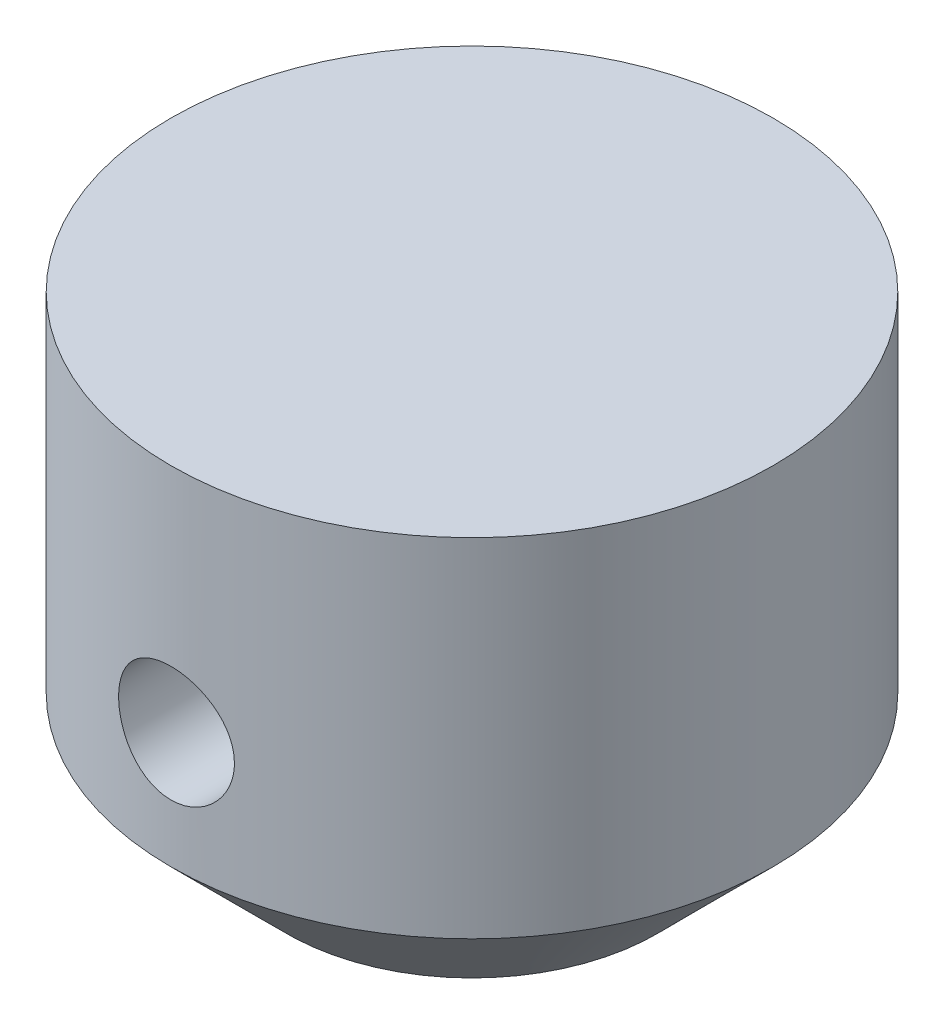
ISO-10303-21;
HEADER;
FILE_DESCRIPTION(('STEP AP214'),'2;1');
FILE_NAME('part.step','',(''),(''),'','','');
FILE_SCHEMA(('AUTOMOTIVE_DESIGN { 1 0 10303 214 1 1 1 1 }'));
ENDSEC;
DATA;
#1=APPLICATION_CONTEXT('core data for automotive mechanical design processes');
#2=APPLICATION_PROTOCOL_DEFINITION('international standard','automotive_design',2000,#1);
#3=PRODUCT_CONTEXT('',#1,'mechanical');
#4=PRODUCT('Part','Part','',(#3));
#5=PRODUCT_RELATED_PRODUCT_CATEGORY('part','',(#4));
#6=PRODUCT_DEFINITION_FORMATION('','',#4);
#7=PRODUCT_DEFINITION_CONTEXT('part definition',#1,'design');
#8=PRODUCT_DEFINITION('design','',#6,#7);
#9=PRODUCT_DEFINITION_SHAPE('','',#8);
#10=(LENGTH_UNIT() NAMED_UNIT(*) SI_UNIT(.MILLI.,.METRE.));
#11=(NAMED_UNIT(*) PLANE_ANGLE_UNIT() SI_UNIT($,.RADIAN.));
#12=(NAMED_UNIT(*) SI_UNIT($,.STERADIAN.) SOLID_ANGLE_UNIT());
#13=UNCERTAINTY_MEASURE_WITH_UNIT(LENGTH_MEASURE(1.E-05),#10,'distance_accuracy_value','');
#14=(GEOMETRIC_REPRESENTATION_CONTEXT(3) GLOBAL_UNCERTAINTY_ASSIGNED_CONTEXT((#13)) GLOBAL_UNIT_ASSIGNED_CONTEXT((#10,
#11,#12)) REPRESENTATION_CONTEXT('',''));
#15=CARTESIAN_POINT('',(0.,0.,0.));
#16=DIRECTION('',(0.,0.,1.));
#17=DIRECTION('',(1.,0.,0.));
#18=AXIS2_PLACEMENT_3D('',#15,#16,#17);
#19=CARTESIAN_POINT('',(0.,-32.,0.));
#20=DIRECTION('',(0.,1.,0.));
#21=DIRECTION('',(0.,0.,1.));
#22=AXIS2_PLACEMENT_3D('',#19,#20,#21);
#23=PLANE('',#22);
#24=CARTESIAN_POINT('',(0.,-32.,0.));
#25=DIRECTION('',(0.,-1.,0.));
#26=DIRECTION('',(0.,0.,-1.));
#27=AXIS2_PLACEMENT_3D('',#24,#25,#26);
#28=CIRCLE('',#27,2.6);
#29=CARTESIAN_POINT('',(0.,-32.,-2.6));
#30=VERTEX_POINT('',#29);
#31=EDGE_CURVE('E10',#30,#30,#28,.T.);
#32=ORIENTED_EDGE('',*,*,#31,.F.);
#33=EDGE_LOOP('',(#32));
#34=FACE_BOUND('',#33,.T.);
#35=ADVANCED_FACE('F31',(#34),#23,.T.);
#36=CARTESIAN_POINT('',(0.,-40.,0.));
#37=DIRECTION('',(0.,-1.,0.));
#38=DIRECTION('',(0.,0.,-1.));
#39=AXIS2_PLACEMENT_3D('',#36,#37,#38);
#40=CYLINDRICAL_SURFACE('',#39,2.6);
#41=CARTESIAN_POINT('',(0.,-33.5,-2.6));
#42=CARTESIAN_POINT('',(0.0278105320361505,-33.5000010482439,-2.59999949221967));
#43=CARTESIAN_POINT('',(0.0556345546144306,-33.5023281174596,-2.59954919613991));
#44=CARTESIAN_POINT('',(0.110497626618271,-33.5115683889724,-2.59779628991213));
#45=CARTESIAN_POINT('',(0.137536008978919,-33.5184853761372,-2.5964929763741));
#46=CARTESIAN_POINT('',(0.190026507492474,-33.5366851160976,-2.59317972986679));
#47=CARTESIAN_POINT('',(0.215480063942747,-33.5479638356547,-2.59117044985226));
#48=CARTESIAN_POINT('',(0.264131447684717,-33.5745552255853,-2.58666430975677));
#49=CARTESIAN_POINT('',(0.287329439097689,-33.5898676021572,-2.58416748519075));
#50=CARTESIAN_POINT('',(0.331104865948445,-33.6242958331416,-2.57892646004871));
#51=CARTESIAN_POINT('',(0.35164985907351,-33.6434525662902,-2.57617979097233));
#52=CARTESIAN_POINT('',(0.389255337231235,-33.6849378074389,-2.57076682723467));
#53=CARTESIAN_POINT('',(0.406315563890704,-33.7072665504153,-2.56810053854555));
#54=CARTESIAN_POINT('',(0.436603359241242,-33.7546927990716,-2.56312618803904));
#55=CARTESIAN_POINT('',(0.449797702900451,-33.7798118862201,-2.56082130653019));
#56=CARTESIAN_POINT('',(0.471766440630374,-33.8319619820053,-2.55686562512146));
#57=CARTESIAN_POINT('',(0.480541236670556,-33.8589928165085,-2.55521476573947));
#58=CARTESIAN_POINT('',(0.493317220914277,-33.9138512383438,-2.55277894025527));
#59=CARTESIAN_POINT('',(0.497375117583084,-33.9416651533394,-2.55198369644114));
#60=CARTESIAN_POINT('',(0.500778180369521,-33.997589527384,-2.5513181755189));
#61=CARTESIAN_POINT('',(0.500123791374384,-34.0256999581887,-2.55144781109284));
#62=CARTESIAN_POINT('',(0.494166791217106,-34.0810070446324,-2.55260805168359));
#63=CARTESIAN_POINT('',(0.488928861300105,-34.108210968953,-2.55362611893243));
#64=CARTESIAN_POINT('',(0.474055416271553,-34.1613465966231,-2.55642880078043));
#65=CARTESIAN_POINT('',(0.464419705520661,-34.1872782433175,-2.55821344948145));
#66=CARTESIAN_POINT('',(0.440961530918623,-34.2373213887639,-2.56236120704715));
#67=CARTESIAN_POINT('',(0.427113131194455,-34.2614204221016,-2.56472788141454));
#68=CARTESIAN_POINT('',(0.395641010178694,-34.3069769942277,-2.56977069421259));
#69=CARTESIAN_POINT('',(0.378016886537293,-34.3284342511183,-2.57244686560998));
#70=CARTESIAN_POINT('',(0.339145782265337,-34.3684717068442,-2.57786164761939));
#71=CARTESIAN_POINT('',(0.317843522311988,-34.3869982380074,-2.58060055730789));
#72=CARTESIAN_POINT('',(0.272405331230797,-34.4202231014601,-2.58579144205795));
#73=CARTESIAN_POINT('',(0.248269368824891,-34.4349213914882,-2.58824341395175));
#74=CARTESIAN_POINT('',(0.197791552497752,-34.4600812094079,-2.59258949722063));
#75=CARTESIAN_POINT('',(0.171446742608608,-34.4705369469234,-2.5944828452127));
#76=CARTESIAN_POINT('',(0.117330113839421,-34.4868594846694,-2.59749249443284));
#77=CARTESIAN_POINT('',(0.0895584549284664,-34.492726798133,-2.5986088825654));
#78=CARTESIAN_POINT('',(0.0338379830289236,-34.4996307532307,-2.59992682566096));
#79=CARTESIAN_POINT('',(0.00589859559906434,-34.5007408943682,-2.60014229870909));
#80=CARTESIAN_POINT('',(-0.0497665273185639,-34.4982964445607,-2.59967265997688));
#81=CARTESIAN_POINT('',(-0.0774922737973493,-34.4947420952195,-2.5989875948412));
#82=CARTESIAN_POINT('',(-0.131708448516044,-34.483130651201,-2.59680253743915));
#83=CARTESIAN_POINT('',(-0.158207180744999,-34.4751109443148,-2.59530931462721));
#84=CARTESIAN_POINT('',(-0.20948391120038,-34.4548370439751,-2.59167470897715));
#85=CARTESIAN_POINT('',(-0.234261787783941,-34.4425825515405,-2.58953328037625));
#86=CARTESIAN_POINT('',(-0.281705736534493,-34.4140256513651,-2.5848050930694));
#87=CARTESIAN_POINT('',(-0.304344437052664,-34.3976785816926,-2.58221352450716));
#88=CARTESIAN_POINT('',(-0.346583721086208,-34.3614607553005,-2.57688451035751));
#89=CARTESIAN_POINT('',(-0.366184004761787,-34.3415896512332,-2.5741470504089));
#90=CARTESIAN_POINT('',(-0.402071020329724,-34.2985543677208,-2.56878832767845));
#91=CARTESIAN_POINT('',(-0.418307478477022,-34.2753479499434,-2.56616923031455));
#92=CARTESIAN_POINT('',(-0.446651897666632,-34.2264939351453,-2.56138820751886));
#93=CARTESIAN_POINT('',(-0.458760016864744,-34.2008464316903,-2.55922626457479));
#94=CARTESIAN_POINT('',(-0.478433768375435,-34.1479627282108,-2.55562151463548));
#95=CARTESIAN_POINT('',(-0.486021955190554,-34.1207351733065,-2.5541751431704));
#96=CARTESIAN_POINT('',(-0.496509581086891,-34.0653609853587,-2.55215737464282));
#97=CARTESIAN_POINT('',(-0.499409579983776,-34.0372144624585,-2.55158587311269));
#98=CARTESIAN_POINT('',(-0.500419023374696,-33.9813053288157,-2.55138804101293));
#99=CARTESIAN_POINT('',(-0.498607820424415,-33.9535441754065,-2.5517460540877));
#100=CARTESIAN_POINT('',(-0.490420533076082,-33.8987300110987,-2.55333209593232));
#101=CARTESIAN_POINT('',(-0.484044479382371,-33.8716769954382,-2.55456011885027));
#102=CARTESIAN_POINT('',(-0.466942695434997,-33.8190926760316,-2.55774106519254));
#103=CARTESIAN_POINT('',(-0.456225988400775,-33.7935583408165,-2.55969248413398));
#104=CARTESIAN_POINT('',(-0.430755941571054,-33.7446375276218,-2.56410133067948));
#105=CARTESIAN_POINT('',(-0.416002296269836,-33.7212512123782,-2.56655879657648));
#106=CARTESIAN_POINT('',(-0.382603127628857,-33.6768936850631,-2.57175118060547));
#107=CARTESIAN_POINT('',(-0.363900019707691,-33.6559662637036,-2.57448985593022));
#108=CARTESIAN_POINT('',(-0.323252476970016,-33.6175205249011,-2.57990840632291));
#109=CARTESIAN_POINT('',(-0.301307298652148,-33.6000029915864,-2.58258826774076));
#110=CARTESIAN_POINT('',(-0.254547251469325,-33.5687173966289,-2.58761731411782));
#111=CARTESIAN_POINT('',(-0.229706986973882,-33.5549867259862,-2.58996309802487));
#112=CARTESIAN_POINT('',(-0.178034451870081,-33.5319158415272,-2.59402638153398));
#113=CARTESIAN_POINT('',(-0.151204050658971,-33.5225715664262,-2.59574446198726));
#114=CARTESIAN_POINT('',(-0.103584713141109,-33.5104030831571,-2.59801468750044));
#115=CARTESIAN_POINT('',(-0.0830714879403355,-33.5065087020495,-2.59875491800667));
#116=CARTESIAN_POINT('',(-0.0417080317029372,-33.5013068032726,-2.59974775790777));
#117=CARTESIAN_POINT('',(-0.0208578100340655,-33.4999992138204,-2.60000038083362));
#118=CARTESIAN_POINT('',(0.,-33.5,-2.6));
#119=B_SPLINE_CURVE_WITH_KNOTS('',3,(#41,#42,#43,#44,#45,#46,#47,#48,#49,#50,#51,#52,#53,#54,
#55,#56,#57,#58,#59,#60,#61,#62,#63,#64,#65,#66,#67,#68,#69,#70,#71,#72,#73,#74,#75,#76,#77,#78,
#79,#80,#81,#82,#83,#84,#85,#86,#87,#88,#89,#90,#91,#92,#93,#94,#95,#96,#97,#98,#99,#100,#101,
#102,#103,#104,#105,#106,#107,#108,#109,#110,#111,#112,#113,#114,#115,#116,#117,#118),
.UNSPECIFIED.,.T.,.F.,(4,2,2,2,2,2,2,2,2,2,2,2,2,2,2,2,2,2,2,2,2,2,2,2,2,2,2,2,2,2,2,2,2,2,2,2,
2,2,4),(0.,0.0833553081145132,0.166779436959304,0.250126608314659,0.333467710549167,
0.417747064808198,0.502032665577042,0.587022723648483,0.672005050254293,0.75595475796966,
0.839896540090919,0.922672529398886,1.00545220143214,1.08875219974061,1.17206107910736,
1.25675278715131,1.34144543009992,1.42625327868009,1.51105163981266,1.59453501139906,
1.67801405901662,1.76080443698833,1.84360066125531,1.92734314190811,2.01109388125848,
2.096018049533,2.18093896401477,2.26543249308995,2.34991593206271,2.43298563424709,
2.51605477768889,2.59895211856998,2.68185573465715,2.7660638086393,2.85029122405397,
2.93532272054677,3.02027533186145,3.08279328109365,3.14530949544452),.UNSPECIFIED.);
#120=CARTESIAN_POINT('',(0.,-33.5,-2.6));
#121=VERTEX_POINT('',#120);
#122=EDGE_CURVE('E34',#121,#121,#119,.T.);
#123=ORIENTED_EDGE('',*,*,#122,.F.);
#124=EDGE_LOOP('',(#123));
#125=FACE_BOUND('',#124,.T.);
#126=CARTESIAN_POINT('',(0.5,-34.,2.55147016443461));
#127=CARTESIAN_POINT('',(0.499998947542569,-33.972194828052,2.5514707090019));
#128=CARTESIAN_POINT('',(0.497672744922004,-33.9443761539758,2.55192962171195));
#129=CARTESIAN_POINT('',(0.488436227441484,-33.8895241882344,2.55371324682503));
#130=CARTESIAN_POINT('',(0.481522107224091,-33.8624915679906,2.55503867793111));
#131=CARTESIAN_POINT('',(0.463330749326355,-33.8100132710475,2.55839980127171));
#132=CARTESIAN_POINT('',(0.452057679705415,-33.784566105234,2.56043481481625));
#133=CARTESIAN_POINT('',(0.425479607106329,-33.7359254900133,2.56498500315722));
#134=CARTESIAN_POINT('',(0.410174884812432,-33.7127318838667,2.56750014452372));
#135=CARTESIAN_POINT('',(0.375754491644792,-33.6689517575125,2.57276395733468));
#136=CARTESIAN_POINT('',(0.356596223727371,-33.6483990100983,2.5755150220435));
#137=CARTESIAN_POINT('',(0.315104624516136,-33.6107784939706,2.58091959605602));
#138=CARTESIAN_POINT('',(0.292771079698348,-33.5937109598111,2.58357309878398));
#139=CARTESIAN_POINT('',(0.245340374215246,-33.5634153179484,2.58850927538913));
#140=CARTESIAN_POINT('',(0.220222457774032,-33.550219148259,2.59078879971796));
#141=CARTESIAN_POINT('',(0.168074895722151,-33.5282467149346,2.59469335391021));
#142=CARTESIAN_POINT('',(0.141045415707559,-33.519470068976,2.59631844038522));
#143=CARTESIAN_POINT('',(0.0861921690346895,-33.5066905192989,2.59871411017994));
#144=CARTESIAN_POINT('',(0.0583821276250202,-33.502630644976,2.59949488321994));
#145=CARTESIAN_POINT('',(0.0024654141881919,-33.4992222833556,2.60014910235426));
#146=CARTESIAN_POINT('',(-0.0256412311005026,-33.4998733749328,2.6000226295496));
#147=CARTESIAN_POINT('',(-0.0809623160579727,-33.5058249525212,2.59888454465995));
#148=CARTESIAN_POINT('',(-0.108183631217933,-33.5110640866262,2.59788461302393));
#149=CARTESIAN_POINT('',(-0.16135340993074,-33.5259458908625,2.59512509075811));
#150=CARTESIAN_POINT('',(-0.187301825301269,-33.5355887275423,2.59336547139697));
#151=CARTESIAN_POINT('',(-0.237366073448772,-33.5590620564288,2.58926486516198));
#152=CARTESIAN_POINT('',(-0.261470207038683,-33.572916889057,2.58692051374894));
#153=CARTESIAN_POINT('',(-0.307034293635919,-33.6044029587879,2.58190939572657));
#154=CARTESIAN_POINT('',(-0.328493963961025,-33.6220345990651,2.57924259470896));
#155=CARTESIAN_POINT('',(-0.36852369388809,-33.6609113018337,2.5738309069867));
#156=CARTESIAN_POINT('',(-0.387041577972691,-33.682210046847,2.57108545456181));
#157=CARTESIAN_POINT('',(-0.420250632706316,-33.7276380349345,2.56586687995174));
#158=CARTESIAN_POINT('',(-0.434941741447775,-33.7517673237906,2.56339376217262));
#159=CARTESIAN_POINT('',(-0.460096266503748,-33.8022428034542,2.55899893732967));
#160=CARTESIAN_POINT('',(-0.470551774921117,-33.8285930310247,2.55707826360321));
#161=CARTESIAN_POINT('',(-0.486872220148259,-33.8827215108758,2.55402135344012));
#162=CARTESIAN_POINT('',(-0.49273770637958,-33.9104995918193,2.55288502312021));
#163=CARTESIAN_POINT('',(-0.499634750441872,-33.9662238649257,2.55154412275902));
#164=CARTESIAN_POINT('',(-0.500741413971326,-33.9941604227368,2.55132507721333));
#165=CARTESIAN_POINT('',(-0.498291019927682,-34.0498190727739,2.55180476616839));
#166=CARTESIAN_POINT('',(-0.4947342056805,-34.0775411761137,2.55250345278471));
#167=CARTESIAN_POINT('',(-0.483122401197692,-34.1317349886385,2.55472637060047));
#168=CARTESIAN_POINT('',(-0.475107069349229,-34.1582155208333,2.5562433198263));
#169=CARTESIAN_POINT('',(-0.454847957308261,-34.2094577694909,2.55992552504786));
#170=CARTESIAN_POINT('',(-0.442603851473006,-34.2342193534072,2.56209083096951));
#171=CARTESIAN_POINT('',(-0.414062971823536,-34.281650848477,2.56685857074238));
#172=CARTESIAN_POINT('',(-0.397718922456543,-34.3042918028875,2.56946597998689));
#173=CARTESIAN_POINT('',(-0.361505575576465,-34.3465370237732,2.5748102724859));
#174=CARTESIAN_POINT('',(-0.341635943857633,-34.3661410020294,2.57754716799694));
#175=CARTESIAN_POINT('',(-0.298599362506024,-34.4020379504067,2.58288874565802));
#176=CARTESIAN_POINT('',(-0.275389848707324,-34.4182803064115,2.58549101777384));
#177=CARTESIAN_POINT('',(-0.226527880453212,-34.446635061219,2.59022908608141));
#178=CARTESIAN_POINT('',(-0.200875523447793,-34.4587476246793,2.59236490086991));
#179=CARTESIAN_POINT('',(-0.147993322740102,-34.4784239459671,2.59591906937718));
#180=CARTESIAN_POINT('',(-0.120772849682519,-34.4860121621292,2.59734127408174));
#181=CARTESIAN_POINT('',(-0.0654137550084261,-34.496502238924,2.59932444043486));
#182=CARTESIAN_POINT('',(-0.0372752356083847,-34.4994046194794,2.59988549763276));
#183=CARTESIAN_POINT('',(0.0186365504236367,-34.5004217662985,2.6000811174301));
#184=CARTESIAN_POINT('',(0.0464084057240731,-34.498612844466,2.59973044799484));
#185=CARTESIAN_POINT('',(0.101244581449823,-34.4904263839669,2.59817284039036));
#186=CARTESIAN_POINT('',(0.12830890942843,-34.4840488940931,2.5969659113661));
#187=CARTESIAN_POINT('',(0.180918709850875,-34.4669391615224,2.59383154948978));
#188=CARTESIAN_POINT('',(0.206467042275782,-34.4562154383296,2.59190552678676));
#189=CARTESIAN_POINT('',(0.255412976491685,-34.4307269770987,2.5875410506584));
#190=CARTESIAN_POINT('',(0.27881042410968,-34.4159619496856,2.58510256054109));
#191=CARTESIAN_POINT('',(0.323169591535494,-34.3825493099337,2.5799356961059));
#192=CARTESIAN_POINT('',(0.344089496980017,-34.3638467655831,2.57720352121692));
#193=CARTESIAN_POINT('',(0.382520333223743,-34.3232035634892,2.57178066550606));
#194=CARTESIAN_POINT('',(0.400030459267711,-34.3012621434693,2.56908999461735));
#195=CARTESIAN_POINT('',(0.431306904846719,-34.2545060322045,2.5640258452719));
#196=CARTESIAN_POINT('',(0.445034783203871,-34.2296652481983,2.56165574006755));
#197=CARTESIAN_POINT('',(0.46810030886517,-34.1779918452311,2.55754188332592));
#198=CARTESIAN_POINT('',(0.477442039558376,-34.1511611059269,2.5557975495702));
#199=CARTESIAN_POINT('',(0.489604272441328,-34.1035483250539,2.55349061919027));
#200=CARTESIAN_POINT('',(0.493495878958447,-34.0830424024803,2.5527375216888));
#201=CARTESIAN_POINT('',(0.498694098796309,-34.0416935107314,2.55172709752426));
#202=CARTESIAN_POINT('',(0.50000078921713,-34.0208505516275,2.55146975607431));
#203=CARTESIAN_POINT('',(0.5,-34.,2.55147016443461));
#204=B_SPLINE_CURVE_WITH_KNOTS('',3,(#126,#127,#128,#129,#130,#131,#132,#133,#134,#135,#136,
#137,#138,#139,#140,#141,#142,#143,#144,#145,#146,#147,#148,#149,#150,#151,#152,#153,#154,#155,
#156,#157,#158,#159,#160,#161,#162,#163,#164,#165,#166,#167,#168,#169,#170,#171,#172,#173,#174,
#175,#176,#177,#178,#179,#180,#181,#182,#183,#184,#185,#186,#187,#188,#189,#190,#191,#192,#193,
#194,#195,#196,#197,#198,#199,#200,#201,#202,#203),.UNSPECIFIED.,.T.,.F.,(4,2,2,2,2,2,2,2,2,2,2,
2,2,2,2,2,2,2,2,2,2,2,2,2,2,2,2,2,2,2,2,2,2,2,2,2,2,2,4),(0.,0.0833391977700211,
0.166747606135934,0.250076455217348,0.333399504464598,0.417699943651171,0.502006054370184,
0.58698928435361,0.671965161355514,0.755903638150818,0.839834611564477,0.922660098044567,
1.0054887172532,1.08880539343955,1.17213096812357,1.2568001838647,1.34147076925495,
1.42629871467811,1.51111650471832,1.59459063578512,1.67806041160203,1.76079933217464,
1.84354462559654,1.92729181840957,2.01104695423965,2.0959837188539,2.18091709658579,
2.26538706594041,2.34984766218162,2.43294873718912,2.51604892467846,2.5989870006597,
2.68193101692095,2.76611956404469,2.85032795681521,2.93536303815768,3.02031879631406,
3.08281508587339,3.14530951133299),.UNSPECIFIED.);
#205=CARTESIAN_POINT('',(0.5,-34.,2.55147016443461));
#206=VERTEX_POINT('',#205);
#207=EDGE_CURVE('E50',#206,#206,#204,.T.);
#208=ORIENTED_EDGE('',*,*,#207,.F.);
#209=EDGE_LOOP('',(#208));
#210=FACE_BOUND('',#209,.T.);
#211=ORIENTED_EDGE('',*,*,#31,.T.);
#212=EDGE_LOOP('',(#211));
#213=FACE_BOUND('',#212,.T.);
#214=CARTESIAN_POINT('',(0.,-35.,0.));
#215=DIRECTION('',(0.,-1.,0.));
#216=DIRECTION('',(0.,0.,-1.));
#217=AXIS2_PLACEMENT_3D('',#214,#215,#216);
#218=CIRCLE('',#217,2.6);
#219=CARTESIAN_POINT('',(0.,-35.,-2.6));
#220=VERTEX_POINT('',#219);
#221=EDGE_CURVE('E42',#220,#220,#218,.T.);
#222=ORIENTED_EDGE('',*,*,#221,.F.);
#223=EDGE_LOOP('',(#222));
#224=FACE_BOUND('',#223,.T.);
#225=ADVANCED_FACE('F55',(#125,#210,#213,#224),#40,.T.);
#226=CARTESIAN_POINT('',(0.,-36.,0.));
#227=DIRECTION('',(0.,1.,0.));
#228=DIRECTION('',(0.,0.,1.));
#229=AXIS2_PLACEMENT_3D('',#226,#227,#228);
#230=CONICAL_SURFACE('',#229,1.6,0.785398163397448);
#231=ORIENTED_EDGE('',*,*,#221,.T.);
#232=EDGE_LOOP('',(#231));
#233=FACE_BOUND('',#232,.T.);
#234=CARTESIAN_POINT('',(0.,-36.,0.));
#235=DIRECTION('',(0.,-1.,0.));
#236=DIRECTION('',(0.,0.,-1.));
#237=AXIS2_PLACEMENT_3D('',#234,#235,#236);
#238=CIRCLE('',#237,1.6);
#239=CARTESIAN_POINT('',(0.,-36.,-1.6));
#240=VERTEX_POINT('',#239);
#241=EDGE_CURVE('E47',#240,#240,#238,.T.);
#242=ORIENTED_EDGE('',*,*,#241,.F.);
#243=EDGE_LOOP('',(#242));
#244=FACE_BOUND('',#243,.T.);
#245=ADVANCED_FACE('F66',(#233,#244),#230,.T.);
#246=CARTESIAN_POINT('',(1.6,-36.,0.));
#247=DIRECTION('',(0.,-1.,0.));
#248=DIRECTION('',(0.,0.,-1.));
#249=AXIS2_PLACEMENT_3D('',#246,#247,#248);
#250=PLANE('',#249);
#251=ORIENTED_EDGE('',*,*,#241,.T.);
#252=EDGE_LOOP('',(#251));
#253=FACE_BOUND('',#252,.T.);
#254=ADVANCED_FACE('F62',(#253),#250,.T.);
#255=CARTESIAN_POINT('',(0.,-34.,-1000.));
#256=DIRECTION('',(0.,0.,1.));
#257=DIRECTION('',(1.,0.,0.));
#258=AXIS2_PLACEMENT_3D('',#255,#256,#257);
#259=CYLINDRICAL_SURFACE('',#258,0.5);
#260=ORIENTED_EDGE('',*,*,#122,.T.);
#261=EDGE_LOOP('',(#260));
#262=FACE_BOUND('',#261,.T.);
#263=ORIENTED_EDGE('',*,*,#207,.T.);
#264=EDGE_LOOP('',(#263));
#265=FACE_BOUND('',#264,.T.);
#266=ADVANCED_FACE('F58',(#262,#265),#259,.F.);
#267=CLOSED_SHELL('',(#35,#225,#245,#254,#266));
#268=MANIFOLD_SOLID_BREP('B2',#267);
#269=ADVANCED_BREP_SHAPE_REPRESENTATION('',(#18,#268),#14);
#270=SHAPE_DEFINITION_REPRESENTATION(#9,#269);
ENDSEC;
END-ISO-10303-21;
